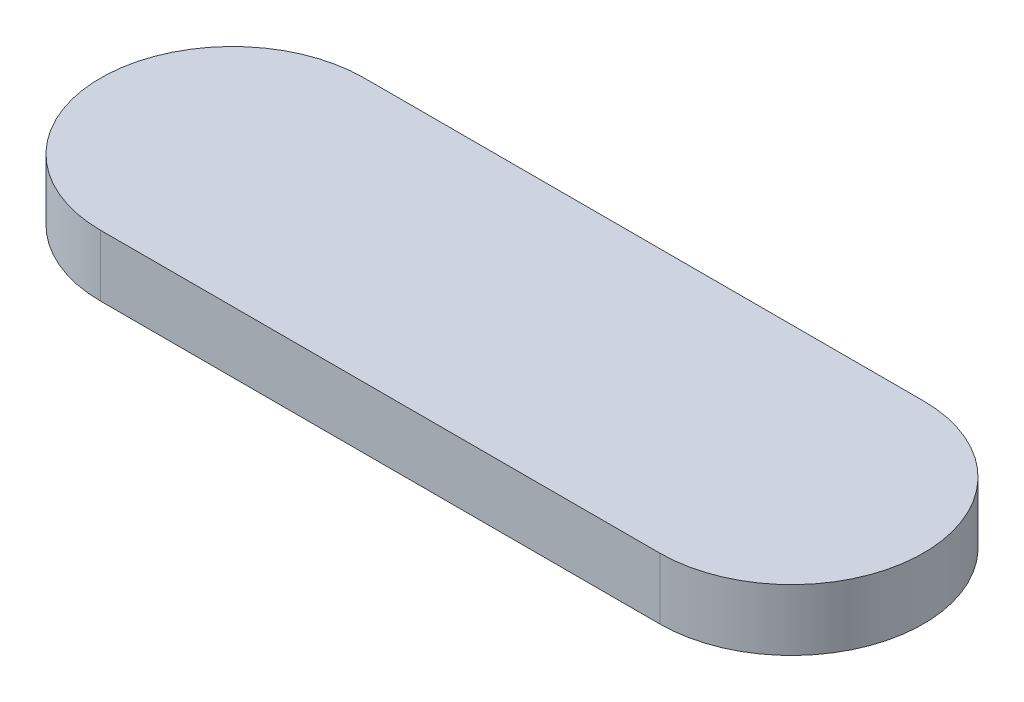
ISO-10303-21;
HEADER;
FILE_DESCRIPTION(('STEP AP214'),'2;1');
FILE_NAME('part.step','',(''),(''),'','','');
FILE_SCHEMA(('AUTOMOTIVE_DESIGN { 1 0 10303 214 1 1 1 1 }'));
ENDSEC;
DATA;
#1=APPLICATION_CONTEXT('core data for automotive mechanical design processes');
#2=APPLICATION_PROTOCOL_DEFINITION('international standard','automotive_design',2000,#1);
#3=PRODUCT_CONTEXT('',#1,'mechanical');
#4=PRODUCT('Part','Part','',(#3));
#5=PRODUCT_RELATED_PRODUCT_CATEGORY('part','',(#4));
#6=PRODUCT_DEFINITION_FORMATION('','',#4);
#7=PRODUCT_DEFINITION_CONTEXT('part definition',#1,'design');
#8=PRODUCT_DEFINITION('design','',#6,#7);
#9=PRODUCT_DEFINITION_SHAPE('','',#8);
#10=(LENGTH_UNIT() NAMED_UNIT(*) SI_UNIT(.MILLI.,.METRE.));
#11=(NAMED_UNIT(*) PLANE_ANGLE_UNIT() SI_UNIT($,.RADIAN.));
#12=(NAMED_UNIT(*) SI_UNIT($,.STERADIAN.) SOLID_ANGLE_UNIT());
#13=UNCERTAINTY_MEASURE_WITH_UNIT(LENGTH_MEASURE(1.E-05),#10,'distance_accuracy_value','');
#14=(GEOMETRIC_REPRESENTATION_CONTEXT(3) GLOBAL_UNCERTAINTY_ASSIGNED_CONTEXT((#13)) GLOBAL_UNIT_ASSIGNED_CONTEXT((#10,
#11,#12)) REPRESENTATION_CONTEXT('',''));
#15=CARTESIAN_POINT('',(0.,0.,0.));
#16=DIRECTION('',(0.,0.,1.));
#17=DIRECTION('',(1.,0.,0.));
#18=AXIS2_PLACEMENT_3D('',#15,#16,#17);
#19=CARTESIAN_POINT('',(-11.2075851303039,2.7,2.82113527992087));
#20=DIRECTION('',(0.,-1.,0.));
#21=DIRECTION('',(0.,0.,-1.));
#22=AXIS2_PLACEMENT_3D('',#19,#20,#21);
#23=CYLINDRICAL_SURFACE('',#22,5.8);
#24=CARTESIAN_POINT('',(-11.2075851303039,0.,2.82113527992087));
#25=DIRECTION('',(0.,1.,0.));
#26=DIRECTION('',(0.,0.,1.));
#27=AXIS2_PLACEMENT_3D('',#24,#25,#26);
#28=CIRCLE('',#27,5.8);
#29=CARTESIAN_POINT('',(-11.2075851303039,0.,-2.97886472007913));
#30=VERTEX_POINT('',#29);
#31=CARTESIAN_POINT('',(-11.2075851303039,0.,8.62113527992087));
#32=VERTEX_POINT('',#31);
#33=EDGE_CURVE('E102',#30,#32,#28,.T.);
#34=ORIENTED_EDGE('',*,*,#33,.T.);
#35=DIRECTION('',(0.,-1.,0.));
#36=VECTOR('',#35,1.);
#37=CARTESIAN_POINT('',(-11.2075851303039,2.7,8.62113527992087));
#38=LINE('',#37,#36);
#39=CARTESIAN_POINT('',(-11.2075851303039,2.7,8.62113527992087));
#40=VERTEX_POINT('',#39);
#41=EDGE_CURVE('E11',#40,#32,#38,.T.);
#42=ORIENTED_EDGE('',*,*,#41,.F.);
#43=CARTESIAN_POINT('',(-11.2075851303039,2.7,2.82113527992087));
#44=DIRECTION('',(0.,1.,0.));
#45=DIRECTION('',(0.,0.,1.));
#46=AXIS2_PLACEMENT_3D('',#43,#44,#45);
#47=CIRCLE('',#46,5.8);
#48=CARTESIAN_POINT('',(-11.2075851303039,2.7,-2.97886472007913));
#49=VERTEX_POINT('',#48);
#50=EDGE_CURVE('E90',#49,#40,#47,.T.);
#51=ORIENTED_EDGE('',*,*,#50,.F.);
#52=DIRECTION('',(0.,-1.,0.));
#53=VECTOR('',#52,1.);
#54=CARTESIAN_POINT('',(-11.2075851303039,2.7,-2.97886472007913));
#55=LINE('',#54,#53);
#56=EDGE_CURVE('E98',#49,#30,#55,.T.);
#57=ORIENTED_EDGE('',*,*,#56,.T.);
#58=EDGE_LOOP('',(#34,#42,#51,#57));
#59=FACE_BOUND('',#58,.T.);
#60=ADVANCED_FACE('F39',(#59),#23,.T.);
#61=CARTESIAN_POINT('',(-11.2075851303039,2.7,8.62113527992087));
#62=DIRECTION('',(0.,0.,-1.));
#63=DIRECTION('',(-1.,0.,0.));
#64=AXIS2_PLACEMENT_3D('',#61,#62,#63);
#65=PLANE('',#64);
#66=DIRECTION('',(1.,0.,0.));
#67=VECTOR('',#66,1.);
#68=CARTESIAN_POINT('',(-11.2075851303039,0.,8.62113527992087));
#69=LINE('',#68,#67);
#70=CARTESIAN_POINT('',(13.3924148696961,0.,8.62113527992087));
#71=VERTEX_POINT('',#70);
#72=EDGE_CURVE('E94',#32,#71,#69,.T.);
#73=ORIENTED_EDGE('',*,*,#72,.T.);
#74=DIRECTION('',(0.,-1.,0.));
#75=VECTOR('',#74,1.);
#76=CARTESIAN_POINT('',(13.3924148696961,2.7,8.62113527992087));
#77=LINE('',#76,#75);
#78=CARTESIAN_POINT('',(13.3924148696961,2.7,8.62113527992087));
#79=VERTEX_POINT('',#78);
#80=EDGE_CURVE('E47',#79,#71,#77,.T.);
#81=ORIENTED_EDGE('',*,*,#80,.F.);
#82=DIRECTION('',(1.,0.,0.));
#83=VECTOR('',#82,1.);
#84=CARTESIAN_POINT('',(-11.2075851303039,2.7,8.62113527992087));
#85=LINE('',#84,#83);
#86=EDGE_CURVE('E85',#40,#79,#85,.T.);
#87=ORIENTED_EDGE('',*,*,#86,.F.);
#88=ORIENTED_EDGE('',*,*,#41,.T.);
#89=EDGE_LOOP('',(#73,#81,#87,#88));
#90=FACE_BOUND('',#89,.T.);
#91=ADVANCED_FACE('F93',(#90),#65,.F.);
#92=CARTESIAN_POINT('',(13.3924148696961,2.7,2.82113527992087));
#93=DIRECTION('',(0.,-1.,0.));
#94=DIRECTION('',(0.,0.,-1.));
#95=AXIS2_PLACEMENT_3D('',#92,#93,#94);
#96=CYLINDRICAL_SURFACE('',#95,5.8);
#97=CARTESIAN_POINT('',(13.3924148696961,0.,2.82113527992087));
#98=DIRECTION('',(0.,1.,0.));
#99=DIRECTION('',(0.,0.,1.));
#100=AXIS2_PLACEMENT_3D('',#97,#98,#99);
#101=CIRCLE('',#100,5.8);
#102=CARTESIAN_POINT('',(13.3924148696961,0.,-2.97886472007913));
#103=VERTEX_POINT('',#102);
#104=EDGE_CURVE('E72',#71,#103,#101,.T.);
#105=ORIENTED_EDGE('',*,*,#104,.T.);
#106=DIRECTION('',(0.,-1.,0.));
#107=VECTOR('',#106,1.);
#108=CARTESIAN_POINT('',(13.3924148696961,2.7,-2.97886472007913));
#109=LINE('',#108,#107);
#110=CARTESIAN_POINT('',(13.3924148696961,2.7,-2.97886472007913));
#111=VERTEX_POINT('',#110);
#112=EDGE_CURVE('E95',#111,#103,#109,.T.);
#113=ORIENTED_EDGE('',*,*,#112,.F.);
#114=CARTESIAN_POINT('',(13.3924148696961,2.7,2.82113527992087));
#115=DIRECTION('',(0.,1.,0.));
#116=DIRECTION('',(0.,0.,1.));
#117=AXIS2_PLACEMENT_3D('',#114,#115,#116);
#118=CIRCLE('',#117,5.8);
#119=EDGE_CURVE('E88',#79,#111,#118,.T.);
#120=ORIENTED_EDGE('',*,*,#119,.F.);
#121=ORIENTED_EDGE('',*,*,#80,.T.);
#122=EDGE_LOOP('',(#105,#113,#120,#121));
#123=FACE_BOUND('',#122,.T.);
#124=ADVANCED_FACE('F96',(#123),#96,.T.);
#125=CARTESIAN_POINT('',(-11.2075851303039,2.7,-2.97886472007913));
#126=DIRECTION('',(0.,0.,1.));
#127=DIRECTION('',(1.,0.,0.));
#128=AXIS2_PLACEMENT_3D('',#125,#126,#127);
#129=PLANE('',#128);
#130=DIRECTION('',(-1.,0.,0.));
#131=VECTOR('',#130,1.);
#132=CARTESIAN_POINT('',(-11.2075851303039,0.,-2.97886472007913));
#133=LINE('',#132,#131);
#134=EDGE_CURVE('E78',#103,#30,#133,.T.);
#135=ORIENTED_EDGE('',*,*,#134,.T.);
#136=ORIENTED_EDGE('',*,*,#56,.F.);
#137=DIRECTION('',(-1.,0.,0.));
#138=VECTOR('',#137,1.);
#139=CARTESIAN_POINT('',(-11.2075851303039,2.7,-2.97886472007913));
#140=LINE('',#139,#138);
#141=EDGE_CURVE('E55',#111,#49,#140,.T.);
#142=ORIENTED_EDGE('',*,*,#141,.F.);
#143=ORIENTED_EDGE('',*,*,#112,.T.);
#144=EDGE_LOOP('',(#135,#136,#142,#143));
#145=FACE_BOUND('',#144,.T.);
#146=ADVANCED_FACE('F109',(#145),#129,.F.);
#147=CARTESIAN_POINT('',(-11.2075851303039,2.7,2.82113527992087));
#148=DIRECTION('',(0.,1.,0.));
#149=DIRECTION('',(0.,0.,1.));
#150=AXIS2_PLACEMENT_3D('',#147,#148,#149);
#151=PLANE('',#150);
#152=ORIENTED_EDGE('',*,*,#50,.T.);
#153=ORIENTED_EDGE('',*,*,#86,.T.);
#154=ORIENTED_EDGE('',*,*,#119,.T.);
#155=ORIENTED_EDGE('',*,*,#141,.T.);
#156=EDGE_LOOP('',(#152,#153,#154,#155));
#157=FACE_BOUND('',#156,.T.);
#158=ADVANCED_FACE('F86',(#157),#151,.T.);
#159=CARTESIAN_POINT('',(-11.2075851303039,0.,2.82113527992087));
#160=DIRECTION('',(0.,1.,0.));
#161=DIRECTION('',(0.,0.,1.));
#162=AXIS2_PLACEMENT_3D('',#159,#160,#161);
#163=PLANE('',#162);
#164=ORIENTED_EDGE('',*,*,#33,.F.);
#165=ORIENTED_EDGE('',*,*,#134,.F.);
#166=ORIENTED_EDGE('',*,*,#104,.F.);
#167=ORIENTED_EDGE('',*,*,#72,.F.);
#168=EDGE_LOOP('',(#164,#165,#166,#167));
#169=FACE_BOUND('',#168,.T.);
#170=ADVANCED_FACE('F112',(#169),#163,.F.);
#171=CLOSED_SHELL('',(#60,#91,#124,#146,#158,#170));
#172=MANIFOLD_SOLID_BREP('B2',#171);
#173=ADVANCED_BREP_SHAPE_REPRESENTATION('',(#18,#172),#14);
#174=SHAPE_DEFINITION_REPRESENTATION(#9,#173);
ENDSEC;
END-ISO-10303-21;
